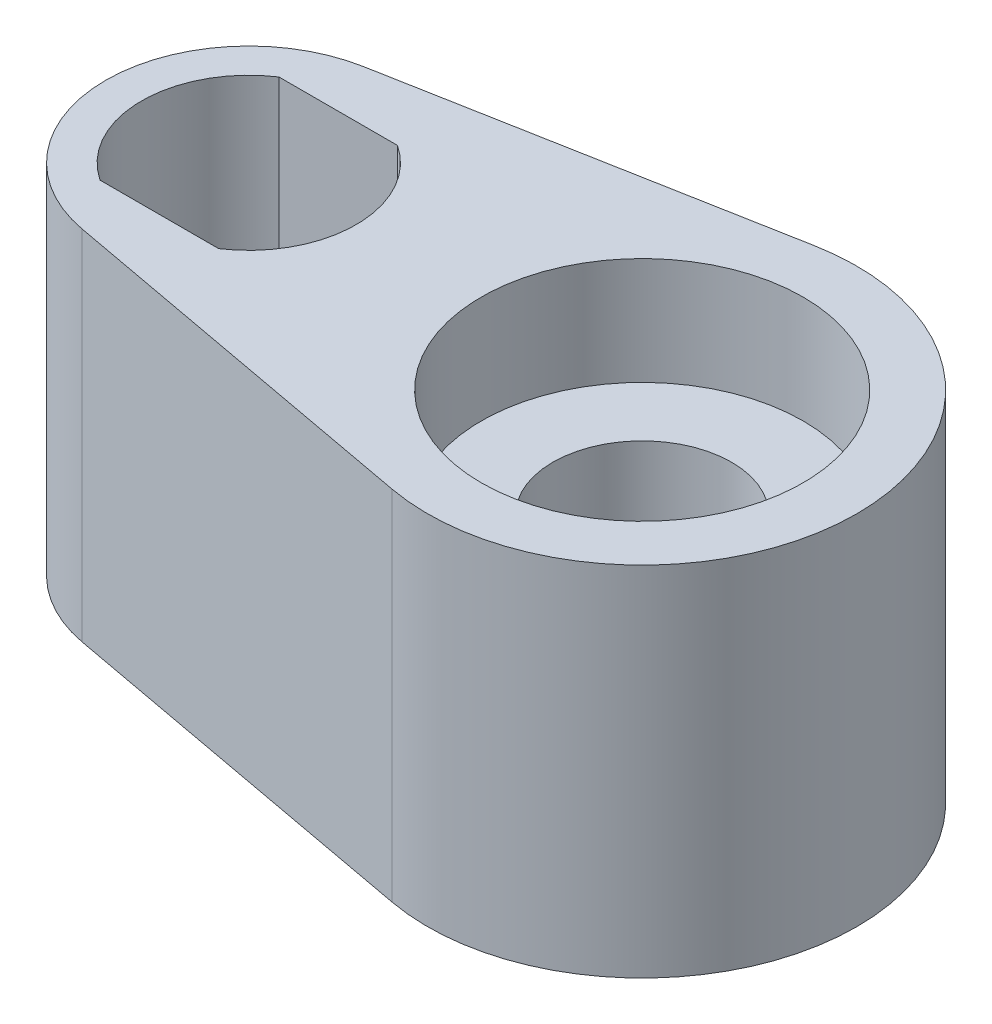
ISO-10303-21;
HEADER;
FILE_DESCRIPTION(('STEP AP214'),'2;1');
FILE_NAME('part.step','',(''),(''),'','','');
FILE_SCHEMA(('AUTOMOTIVE_DESIGN { 1 0 10303 214 1 1 1 1 }'));
ENDSEC;
DATA;
#1=APPLICATION_CONTEXT('core data for automotive mechanical design processes');
#2=APPLICATION_PROTOCOL_DEFINITION('international standard','automotive_design',2000,#1);
#3=PRODUCT_CONTEXT('',#1,'mechanical');
#4=PRODUCT('Part','Part','',(#3));
#5=PRODUCT_RELATED_PRODUCT_CATEGORY('part','',(#4));
#6=PRODUCT_DEFINITION_FORMATION('','',#4);
#7=PRODUCT_DEFINITION_CONTEXT('part definition',#1,'design');
#8=PRODUCT_DEFINITION('design','',#6,#7);
#9=PRODUCT_DEFINITION_SHAPE('','',#8);
#10=(LENGTH_UNIT() NAMED_UNIT(*) SI_UNIT(.MILLI.,.METRE.));
#11=(NAMED_UNIT(*) PLANE_ANGLE_UNIT() SI_UNIT($,.RADIAN.));
#12=(NAMED_UNIT(*) SI_UNIT($,.STERADIAN.) SOLID_ANGLE_UNIT());
#13=UNCERTAINTY_MEASURE_WITH_UNIT(LENGTH_MEASURE(1.E-05),#10,'distance_accuracy_value','');
#14=(GEOMETRIC_REPRESENTATION_CONTEXT(3) GLOBAL_UNCERTAINTY_ASSIGNED_CONTEXT((#13)) GLOBAL_UNIT_ASSIGNED_CONTEXT((#10,
#11,#12)) REPRESENTATION_CONTEXT('',''));
#15=CARTESIAN_POINT('',(0.,0.,0.));
#16=DIRECTION('',(0.,0.,1.));
#17=DIRECTION('',(1.,0.,0.));
#18=AXIS2_PLACEMENT_3D('',#15,#16,#17);
#19=CARTESIAN_POINT('',(11.,37.9069194034805,0.));
#20=DIRECTION('',(0.,-1.,0.));
#21=DIRECTION('',(0.,0.,-1.));
#22=AXIS2_PLACEMENT_3D('',#19,#20,#21);
#23=CYLINDRICAL_SURFACE('',#22,2.5);
#24=CARTESIAN_POINT('',(11.,6.5,0.));
#25=DIRECTION('',(0.,-1.,0.));
#26=DIRECTION('',(0.,0.,-1.));
#27=AXIS2_PLACEMENT_3D('',#24,#25,#26);
#28=CIRCLE('',#27,2.5);
#29=CARTESIAN_POINT('',(11.,6.5,-2.5));
#30=VERTEX_POINT('',#29);
#31=EDGE_CURVE('E120',#30,#30,#28,.T.);
#32=ORIENTED_EDGE('',*,*,#31,.T.);
#33=EDGE_LOOP('',(#32));
#34=FACE_BOUND('',#33,.T.);
#35=CARTESIAN_POINT('',(11.,13.5,0.));
#36=DIRECTION('',(0.,1.,0.));
#37=DIRECTION('',(0.,0.,1.));
#38=AXIS2_PLACEMENT_3D('',#35,#36,#37);
#39=CIRCLE('',#38,2.5);
#40=CARTESIAN_POINT('',(11.,13.5,2.5));
#41=VERTEX_POINT('',#40);
#42=EDGE_CURVE('E149',#41,#41,#39,.F.);
#43=ORIENTED_EDGE('',*,*,#42,.F.);
#44=EDGE_LOOP('',(#43));
#45=FACE_BOUND('',#44,.T.);
#46=ADVANCED_FACE('F35',(#34,#45),#23,.F.);
#47=CARTESIAN_POINT('',(0.,6.5,0.));
#48=DIRECTION('',(0.,-1.,0.));
#49=DIRECTION('',(0.,0.,-1.));
#50=AXIS2_PLACEMENT_3D('',#47,#48,#49);
#51=CYLINDRICAL_SURFACE('',#50,1.1);
#52=CARTESIAN_POINT('',(0.,6.5,0.));
#53=DIRECTION('',(0.,1.,0.));
#54=DIRECTION('',(0.,0.,1.));
#55=AXIS2_PLACEMENT_3D('',#52,#53,#54);
#56=CIRCLE('',#55,1.1);
#57=CARTESIAN_POINT('',(0.,6.5,-1.1));
#58=VERTEX_POINT('',#57);
#59=EDGE_CURVE('E39',#58,#58,#56,.T.);
#60=CARTESIAN_POINT('',(0.,7.5,0.));
#61=DIRECTION('',(0.,1.,0.));
#62=DIRECTION('',(0.,0.,1.));
#63=AXIS2_PLACEMENT_3D('',#60,#61,#62);
#64=CIRCLE('',#63,1.1);
#65=CARTESIAN_POINT('',(0.,7.5,-1.1));
#66=VERTEX_POINT('',#65);
#67=EDGE_CURVE('E44',#66,#66,#64,.T.);
#68=CARTESIAN_POINT('',(0.,6.5,-1.1));
#69=CARTESIAN_POINT('',(0.,6.51041666666667,-1.1));
#70=CARTESIAN_POINT('',(0.,6.52083333333333,-1.1));
#71=CARTESIAN_POINT('',(0.,6.54166666666667,-1.1));
#72=CARTESIAN_POINT('',(0.,6.55208333333333,-1.1));
#73=CARTESIAN_POINT('',(0.,6.57291666666667,-1.1));
#74=CARTESIAN_POINT('',(0.,6.58333333333333,-1.1));
#75=CARTESIAN_POINT('',(0.,6.60416666666667,-1.1));
#76=CARTESIAN_POINT('',(0.,6.61458333333333,-1.1));
#77=CARTESIAN_POINT('',(0.,6.63541666666667,-1.1));
#78=CARTESIAN_POINT('',(0.,6.64583333333333,-1.1));
#79=CARTESIAN_POINT('',(0.,6.66666666666667,-1.1));
#80=CARTESIAN_POINT('',(0.,6.67708333333333,-1.1));
#81=CARTESIAN_POINT('',(0.,6.69791666666667,-1.1));
#82=CARTESIAN_POINT('',(0.,6.70833333333333,-1.1));
#83=CARTESIAN_POINT('',(0.,6.72916666666667,-1.1));
#84=CARTESIAN_POINT('',(0.,6.73958333333333,-1.1));
#85=CARTESIAN_POINT('',(0.,6.76041666666667,-1.1));
#86=CARTESIAN_POINT('',(0.,6.77083333333333,-1.1));
#87=CARTESIAN_POINT('',(0.,6.79166666666667,-1.1));
#88=CARTESIAN_POINT('',(0.,6.80208333333333,-1.1));
#89=CARTESIAN_POINT('',(0.,6.82291666666667,-1.1));
#90=CARTESIAN_POINT('',(0.,6.83333333333333,-1.1));
#91=CARTESIAN_POINT('',(0.,6.85416666666667,-1.1));
#92=CARTESIAN_POINT('',(0.,6.86458333333333,-1.1));
#93=CARTESIAN_POINT('',(0.,6.88541666666667,-1.1));
#94=CARTESIAN_POINT('',(0.,6.89583333333333,-1.1));
#95=CARTESIAN_POINT('',(0.,6.91666666666667,-1.1));
#96=CARTESIAN_POINT('',(0.,6.92708333333333,-1.1));
#97=CARTESIAN_POINT('',(0.,6.94791666666667,-1.1));
#98=CARTESIAN_POINT('',(0.,6.95833333333333,-1.1));
#99=CARTESIAN_POINT('',(0.,6.97916666666667,-1.1));
#100=CARTESIAN_POINT('',(0.,6.98958333333333,-1.1));
#101=CARTESIAN_POINT('',(0.,7.01041666666667,-1.1));
#102=CARTESIAN_POINT('',(0.,7.02083333333333,-1.1));
#103=CARTESIAN_POINT('',(0.,7.04166666666667,-1.1));
#104=CARTESIAN_POINT('',(0.,7.05208333333333,-1.1));
#105=CARTESIAN_POINT('',(0.,7.07291666666667,-1.1));
#106=CARTESIAN_POINT('',(0.,7.08333333333333,-1.1));
#107=CARTESIAN_POINT('',(0.,7.10416666666667,-1.1));
#108=CARTESIAN_POINT('',(0.,7.11458333333333,-1.1));
#109=CARTESIAN_POINT('',(0.,7.13541666666667,-1.1));
#110=CARTESIAN_POINT('',(0.,7.14583333333333,-1.1));
#111=CARTESIAN_POINT('',(0.,7.16666666666667,-1.1));
#112=CARTESIAN_POINT('',(0.,7.17708333333333,-1.1));
#113=CARTESIAN_POINT('',(0.,7.19791666666667,-1.1));
#114=CARTESIAN_POINT('',(0.,7.20833333333333,-1.1));
#115=CARTESIAN_POINT('',(0.,7.22916666666667,-1.1));
#116=CARTESIAN_POINT('',(0.,7.23958333333333,-1.1));
#117=CARTESIAN_POINT('',(0.,7.26041666666667,-1.1));
#118=CARTESIAN_POINT('',(0.,7.27083333333333,-1.1));
#119=CARTESIAN_POINT('',(0.,7.29166666666667,-1.1));
#120=CARTESIAN_POINT('',(0.,7.30208333333333,-1.1));
#121=CARTESIAN_POINT('',(0.,7.32291666666667,-1.1));
#122=CARTESIAN_POINT('',(0.,7.33333333333333,-1.1));
#123=CARTESIAN_POINT('',(0.,7.35416666666667,-1.1));
#124=CARTESIAN_POINT('',(0.,7.36458333333333,-1.1));
#125=CARTESIAN_POINT('',(0.,7.38541666666667,-1.1));
#126=CARTESIAN_POINT('',(0.,7.39583333333333,-1.1));
#127=CARTESIAN_POINT('',(0.,7.41666666666667,-1.1));
#128=CARTESIAN_POINT('',(0.,7.42708333333333,-1.1));
#129=CARTESIAN_POINT('',(0.,7.44791666666667,-1.1));
#130=CARTESIAN_POINT('',(0.,7.45833333333333,-1.1));
#131=CARTESIAN_POINT('',(0.,7.47916666666667,-1.1));
#132=CARTESIAN_POINT('',(0.,7.48958333333333,-1.1));
#133=CARTESIAN_POINT('',(0.,7.5,-1.1));
#134=B_SPLINE_CURVE_WITH_KNOTS('',3,(#68,#69,#70,#71,#72,#73,#74,#75,#76,#77,#78,#79,#80,#81,
#82,#83,#84,#85,#86,#87,#88,#89,#90,#91,#92,#93,#94,#95,#96,#97,#98,#99,#100,#101,#102,#103,
#104,#105,#106,#107,#108,#109,#110,#111,#112,#113,#114,#115,#116,#117,#118,#119,#120,#121,#122,
#123,#124,#125,#126,#127,#128,#129,#130,#131,#132,#133),.UNSPECIFIED.,.F.,.F.,(4,2,2,2,2,2,2,2,
2,2,2,2,2,2,2,2,2,2,2,2,2,2,2,2,2,2,2,2,2,2,2,2,4),(0.,0.03125,0.0625000000000001,
0.0937500000000001,0.125,0.15625,0.1875,0.21875,0.25,0.28125,0.3125,0.34375,0.375,0.40625,
0.4375,0.46875,0.5,0.53125,0.5625,0.593750000000001,0.625000000000001,0.656250000000001,
0.687500000000001,0.718750000000001,0.750000000000001,0.781250000000001,0.812500000000001,
0.843750000000001,0.875000000000001,0.906250000000001,0.9375,0.96875,1.),.UNSPECIFIED.);
#135=EDGE_CURVE('BSEAM37',#58,#66,#134,.T.);
#136=ORIENTED_EDGE('',*,*,#59,.F.);
#137=ORIENTED_EDGE('',*,*,#67,.T.);
#138=ORIENTED_EDGE('',*,*,#135,.T.);
#139=ORIENTED_EDGE('',*,*,#135,.F.);
#140=EDGE_LOOP('',(#136,#138,#137,#139));
#141=FACE_BOUND('',#140,.T.);
#142=ADVANCED_FACE('F37',(#141),#51,.F.);
#143=CARTESIAN_POINT('',(0.,7.5,0.));
#144=DIRECTION('',(0.,1.,0.));
#145=DIRECTION('',(0.,0.,1.));
#146=AXIS2_PLACEMENT_3D('',#143,#144,#145);
#147=PLANE('',#146);
#148=CARTESIAN_POINT('',(0.,7.5,0.));
#149=DIRECTION('',(0.,1.,0.));
#150=DIRECTION('',(0.,0.,1.));
#151=AXIS2_PLACEMENT_3D('',#148,#149,#150);
#152=CIRCLE('',#151,3.);
#153=CARTESIAN_POINT('',(-1.6583123951777,7.5,-2.5));
#154=VERTEX_POINT('',#153);
#155=CARTESIAN_POINT('',(-1.6583123951777,7.5,2.5));
#156=VERTEX_POINT('',#155);
#157=EDGE_CURVE('E110',#154,#156,#152,.T.);
#158=ORIENTED_EDGE('',*,*,#157,.T.);
#159=DIRECTION('',(1.,0.,0.));
#160=VECTOR('',#159,1.);
#161=CARTESIAN_POINT('',(0.,7.5,2.5));
#162=LINE('',#161,#160);
#163=CARTESIAN_POINT('',(1.6583123951777,7.5,2.5));
#164=VERTEX_POINT('',#163);
#165=EDGE_CURVE('E138',#156,#164,#162,.T.);
#166=ORIENTED_EDGE('',*,*,#165,.T.);
#167=CARTESIAN_POINT('',(0.,7.5,0.));
#168=DIRECTION('',(0.,1.,0.));
#169=DIRECTION('',(0.,0.,1.));
#170=AXIS2_PLACEMENT_3D('',#167,#168,#169);
#171=CIRCLE('',#170,3.);
#172=CARTESIAN_POINT('',(1.6583123951777,7.5,-2.5));
#173=VERTEX_POINT('',#172);
#174=EDGE_CURVE('E136',#164,#173,#171,.T.);
#175=ORIENTED_EDGE('',*,*,#174,.T.);
#176=DIRECTION('',(1.,0.,0.));
#177=VECTOR('',#176,1.);
#178=CARTESIAN_POINT('',(0.,7.5,-2.5));
#179=LINE('',#178,#177);
#180=EDGE_CURVE('E60',#154,#173,#179,.T.);
#181=ORIENTED_EDGE('',*,*,#180,.F.);
#182=EDGE_LOOP('',(#158,#166,#175,#181));
#183=FACE_BOUND('',#182,.T.);
#184=ORIENTED_EDGE('',*,*,#67,.F.);
#185=EDGE_LOOP('',(#184));
#186=FACE_BOUND('',#185,.T.);
#187=ADVANCED_FACE('F213',(#183,#186),#147,.T.);
#188=CARTESIAN_POINT('',(0.,6.5,0.));
#189=DIRECTION('',(0.,1.,0.));
#190=DIRECTION('',(0.,0.,1.));
#191=AXIS2_PLACEMENT_3D('',#188,#189,#190);
#192=PLANE('',#191);
#193=CARTESIAN_POINT('',(0.,6.5,0.));
#194=DIRECTION('',(0.,1.,0.));
#195=DIRECTION('',(0.,0.,1.));
#196=AXIS2_PLACEMENT_3D('',#193,#194,#195);
#197=CIRCLE('',#196,4.);
#198=CARTESIAN_POINT('',(-0.727272727272729,6.5,-3.93332866414253));
#199=VERTEX_POINT('',#198);
#200=CARTESIAN_POINT('',(-0.727272727272729,6.5,3.93332866414253));
#201=VERTEX_POINT('',#200);
#202=EDGE_CURVE('E11',#199,#201,#197,.T.);
#203=ORIENTED_EDGE('',*,*,#202,.F.);
#204=DIRECTION('',(0.983332166035634,0.,-0.181818181818182));
#205=VECTOR('',#204,1.);
#206=CARTESIAN_POINT('',(-0.727272727272728,6.5,-3.93332866414253));
#207=LINE('',#206,#205);
#208=CARTESIAN_POINT('',(9.90909090909091,6.5,-5.8999929962138));
#209=VERTEX_POINT('',#208);
#210=EDGE_CURVE('E111',#199,#209,#207,.T.);
#211=ORIENTED_EDGE('',*,*,#210,.T.);
#212=CARTESIAN_POINT('',(11.,6.5,0.));
#213=DIRECTION('',(0.,-1.,0.));
#214=DIRECTION('',(0.,0.,-1.));
#215=AXIS2_PLACEMENT_3D('',#212,#213,#214);
#216=CIRCLE('',#215,6.);
#217=CARTESIAN_POINT('',(9.9090909090909,6.5,5.8999929962138));
#218=VERTEX_POINT('',#217);
#219=EDGE_CURVE('E166',#209,#218,#216,.T.);
#220=ORIENTED_EDGE('',*,*,#219,.T.);
#221=DIRECTION('',(0.983332166035634,0.,0.181818181818182));
#222=VECTOR('',#221,1.);
#223=CARTESIAN_POINT('',(-0.727272727272728,6.5,3.93332866414253));
#224=LINE('',#223,#222);
#225=EDGE_CURVE('E119',#201,#218,#224,.T.);
#226=ORIENTED_EDGE('',*,*,#225,.F.);
#227=EDGE_LOOP('',(#203,#211,#220,#226));
#228=FACE_BOUND('',#227,.T.);
#229=ORIENTED_EDGE('',*,*,#31,.F.);
#230=EDGE_LOOP('',(#229));
#231=FACE_BOUND('',#230,.T.);
#232=ORIENTED_EDGE('',*,*,#59,.T.);
#233=EDGE_LOOP('',(#232));
#234=FACE_BOUND('',#233,.T.);
#235=ADVANCED_FACE('F282',(#228,#231,#234),#192,.F.);
#236=CARTESIAN_POINT('',(0.,7.5,0.));
#237=DIRECTION('',(0.,-1.,0.));
#238=DIRECTION('',(0.,0.,-1.));
#239=AXIS2_PLACEMENT_3D('',#236,#237,#238);
#240=CYLINDRICAL_SURFACE('',#239,4.);
#241=CARTESIAN_POINT('',(0.,16.5,0.));
#242=DIRECTION('',(0.,1.,0.));
#243=DIRECTION('',(0.,0.,1.));
#244=AXIS2_PLACEMENT_3D('',#241,#242,#243);
#245=CIRCLE('',#244,4.);
#246=CARTESIAN_POINT('',(-0.727272727272728,16.5,-3.93332866414253));
#247=VERTEX_POINT('',#246);
#248=CARTESIAN_POINT('',(-0.727272727272729,16.5,3.93332866414253));
#249=VERTEX_POINT('',#248);
#250=EDGE_CURVE('E117',#247,#249,#245,.T.);
#251=ORIENTED_EDGE('',*,*,#250,.F.);
#252=DIRECTION('',(0.,-1.,0.));
#253=VECTOR('',#252,1.);
#254=CARTESIAN_POINT('',(-0.727272727272729,37.9069194034805,-3.93332866414253));
#255=LINE('',#254,#253);
#256=EDGE_CURVE('E172',#247,#199,#255,.T.);
#257=ORIENTED_EDGE('',*,*,#256,.T.);
#258=ORIENTED_EDGE('',*,*,#202,.T.);
#259=DIRECTION('',(0.,-1.,0.));
#260=VECTOR('',#259,1.);
#261=CARTESIAN_POINT('',(-0.727272727272729,37.9069194034805,3.93332866414253));
#262=LINE('',#261,#260);
#263=EDGE_CURVE('E106',#249,#201,#262,.T.);
#264=ORIENTED_EDGE('',*,*,#263,.F.);
#265=EDGE_LOOP('',(#251,#257,#258,#264));
#266=FACE_BOUND('',#265,.T.);
#267=ADVANCED_FACE('F115',(#266),#240,.T.);
#268=CARTESIAN_POINT('',(0.,16.5,0.));
#269=DIRECTION('',(0.,-1.,0.));
#270=DIRECTION('',(0.,0.,-1.));
#271=AXIS2_PLACEMENT_3D('',#268,#269,#270);
#272=CYLINDRICAL_SURFACE('',#271,3.);
#273=ORIENTED_EDGE('',*,*,#157,.F.);
#274=DIRECTION('',(0.,-1.,0.));
#275=VECTOR('',#274,1.);
#276=CARTESIAN_POINT('',(-1.6583123951777,16.5,-2.5));
#277=LINE('',#276,#275);
#278=CARTESIAN_POINT('',(-1.6583123951777,16.5,-2.5));
#279=VERTEX_POINT('',#278);
#280=EDGE_CURVE('E146',#279,#154,#277,.T.);
#281=ORIENTED_EDGE('',*,*,#280,.F.);
#282=CARTESIAN_POINT('',(0.,16.5,0.));
#283=DIRECTION('',(0.,1.,0.));
#284=DIRECTION('',(0.,0.,1.));
#285=AXIS2_PLACEMENT_3D('',#282,#283,#284);
#286=CIRCLE('',#285,3.);
#287=CARTESIAN_POINT('',(-1.6583123951777,16.5,2.5));
#288=VERTEX_POINT('',#287);
#289=EDGE_CURVE('E139',#279,#288,#286,.T.);
#290=ORIENTED_EDGE('',*,*,#289,.T.);
#291=DIRECTION('',(0.,-1.,0.));
#292=VECTOR('',#291,1.);
#293=CARTESIAN_POINT('',(-1.6583123951777,16.5,2.5));
#294=LINE('',#293,#292);
#295=EDGE_CURVE('E123',#288,#156,#294,.T.);
#296=ORIENTED_EDGE('',*,*,#295,.T.);
#297=EDGE_LOOP('',(#273,#281,#290,#296));
#298=FACE_BOUND('',#297,.T.);
#299=ADVANCED_FACE('F196',(#298),#272,.F.);
#300=CARTESIAN_POINT('',(0.,16.5,-2.5));
#301=DIRECTION('',(0.,0.,-1.));
#302=DIRECTION('',(-1.,0.,0.));
#303=AXIS2_PLACEMENT_3D('',#300,#301,#302);
#304=PLANE('',#303);
#305=ORIENTED_EDGE('',*,*,#180,.T.);
#306=DIRECTION('',(0.,-1.,0.));
#307=VECTOR('',#306,1.);
#308=CARTESIAN_POINT('',(1.6583123951777,16.5,-2.5));
#309=LINE('',#308,#307);
#310=CARTESIAN_POINT('',(1.6583123951777,16.5,-2.5));
#311=VERTEX_POINT('',#310);
#312=EDGE_CURVE('E143',#311,#173,#309,.T.);
#313=ORIENTED_EDGE('',*,*,#312,.F.);
#314=DIRECTION('',(1.,0.,0.));
#315=VECTOR('',#314,1.);
#316=CARTESIAN_POINT('',(0.,16.5,-2.5));
#317=LINE('',#316,#315);
#318=EDGE_CURVE('E180',#279,#311,#317,.T.);
#319=ORIENTED_EDGE('',*,*,#318,.F.);
#320=ORIENTED_EDGE('',*,*,#280,.T.);
#321=EDGE_LOOP('',(#305,#313,#319,#320));
#322=FACE_BOUND('',#321,.T.);
#323=ADVANCED_FACE('F198',(#322),#304,.F.);
#324=CARTESIAN_POINT('',(0.,16.5,0.));
#325=DIRECTION('',(0.,-1.,0.));
#326=DIRECTION('',(0.,0.,-1.));
#327=AXIS2_PLACEMENT_3D('',#324,#325,#326);
#328=CYLINDRICAL_SURFACE('',#327,3.);
#329=ORIENTED_EDGE('',*,*,#174,.F.);
#330=DIRECTION('',(0.,-1.,0.));
#331=VECTOR('',#330,1.);
#332=CARTESIAN_POINT('',(1.6583123951777,16.5,2.5));
#333=LINE('',#332,#331);
#334=CARTESIAN_POINT('',(1.6583123951777,16.5,2.5));
#335=VERTEX_POINT('',#334);
#336=EDGE_CURVE('E127',#335,#164,#333,.T.);
#337=ORIENTED_EDGE('',*,*,#336,.F.);
#338=CARTESIAN_POINT('',(0.,16.5,0.));
#339=DIRECTION('',(0.,1.,0.));
#340=DIRECTION('',(0.,0.,1.));
#341=AXIS2_PLACEMENT_3D('',#338,#339,#340);
#342=CIRCLE('',#341,3.);
#343=EDGE_CURVE('E130',#335,#311,#342,.T.);
#344=ORIENTED_EDGE('',*,*,#343,.T.);
#345=ORIENTED_EDGE('',*,*,#312,.T.);
#346=EDGE_LOOP('',(#329,#337,#344,#345));
#347=FACE_BOUND('',#346,.T.);
#348=ADVANCED_FACE('F185',(#347),#328,.F.);
#349=CARTESIAN_POINT('',(0.,16.5,2.5));
#350=DIRECTION('',(0.,0.,-1.));
#351=DIRECTION('',(-1.,0.,0.));
#352=AXIS2_PLACEMENT_3D('',#349,#350,#351);
#353=PLANE('',#352);
#354=ORIENTED_EDGE('',*,*,#165,.F.);
#355=ORIENTED_EDGE('',*,*,#295,.F.);
#356=DIRECTION('',(1.,0.,0.));
#357=VECTOR('',#356,1.);
#358=CARTESIAN_POINT('',(0.,16.5,2.5));
#359=LINE('',#358,#357);
#360=EDGE_CURVE('E124',#288,#335,#359,.T.);
#361=ORIENTED_EDGE('',*,*,#360,.T.);
#362=ORIENTED_EDGE('',*,*,#336,.T.);
#363=EDGE_LOOP('',(#354,#355,#361,#362));
#364=FACE_BOUND('',#363,.T.);
#365=ADVANCED_FACE('F193',(#364),#353,.T.);
#366=CARTESIAN_POINT('',(0.,16.5,0.));
#367=DIRECTION('',(0.,1.,0.));
#368=DIRECTION('',(0.,0.,1.));
#369=AXIS2_PLACEMENT_3D('',#366,#367,#368);
#370=PLANE('',#369);
#371=CARTESIAN_POINT('',(11.,16.5,0.));
#372=DIRECTION('',(0.,1.,0.));
#373=DIRECTION('',(0.,0.,1.));
#374=AXIS2_PLACEMENT_3D('',#371,#372,#373);
#375=CIRCLE('',#374,4.5);
#376=CARTESIAN_POINT('',(11.,16.5,4.5));
#377=VERTEX_POINT('',#376);
#378=EDGE_CURVE('E157',#377,#377,#375,.T.);
#379=ORIENTED_EDGE('',*,*,#378,.F.);
#380=EDGE_LOOP('',(#379));
#381=FACE_BOUND('',#380,.T.);
#382=ORIENTED_EDGE('',*,*,#289,.F.);
#383=ORIENTED_EDGE('',*,*,#318,.T.);
#384=ORIENTED_EDGE('',*,*,#343,.F.);
#385=ORIENTED_EDGE('',*,*,#360,.F.);
#386=EDGE_LOOP('',(#382,#383,#384,#385));
#387=FACE_BOUND('',#386,.T.);
#388=ORIENTED_EDGE('',*,*,#250,.T.);
#389=DIRECTION('',(0.983332166035633,0.,0.181818181818182));
#390=VECTOR('',#389,1.);
#391=CARTESIAN_POINT('',(-0.727272727272728,16.5,3.93332866414253));
#392=LINE('',#391,#390);
#393=CARTESIAN_POINT('',(9.9090909090909,16.5,5.8999929962138));
#394=VERTEX_POINT('',#393);
#395=EDGE_CURVE('E102',#249,#394,#392,.T.);
#396=ORIENTED_EDGE('',*,*,#395,.T.);
#397=CARTESIAN_POINT('',(11.,16.5,0.));
#398=DIRECTION('',(0.,1.,0.));
#399=DIRECTION('',(0.,0.,1.));
#400=AXIS2_PLACEMENT_3D('',#397,#398,#399);
#401=CIRCLE('',#400,6.);
#402=CARTESIAN_POINT('',(9.90909090909091,16.5,-5.8999929962138));
#403=VERTEX_POINT('',#402);
#404=EDGE_CURVE('E151',#403,#394,#401,.F.);
#405=ORIENTED_EDGE('',*,*,#404,.F.);
#406=DIRECTION('',(0.983332166035633,0.,-0.181818181818182));
#407=VECTOR('',#406,1.);
#408=CARTESIAN_POINT('',(-0.727272727272728,16.5,-3.93332866414253));
#409=LINE('',#408,#407);
#410=EDGE_CURVE('E52',#247,#403,#409,.T.);
#411=ORIENTED_EDGE('',*,*,#410,.F.);
#412=EDGE_LOOP('',(#388,#396,#405,#411));
#413=FACE_BOUND('',#412,.T.);
#414=ADVANCED_FACE('F122',(#381,#387,#413),#370,.T.);
#415=CARTESIAN_POINT('',(11.,37.9069194034805,0.));
#416=DIRECTION('',(0.,-1.,0.));
#417=DIRECTION('',(0.,0.,-1.));
#418=AXIS2_PLACEMENT_3D('',#415,#416,#417);
#419=CYLINDRICAL_SURFACE('',#418,6.);
#420=DIRECTION('',(0.,-1.,0.));
#421=VECTOR('',#420,1.);
#422=CARTESIAN_POINT('',(9.90909090909091,37.9069194034805,-5.8999929962138));
#423=LINE('',#422,#421);
#424=EDGE_CURVE('E173',#403,#209,#423,.T.);
#425=ORIENTED_EDGE('',*,*,#424,.F.);
#426=ORIENTED_EDGE('',*,*,#404,.T.);
#427=DIRECTION('',(0.,-1.,0.));
#428=VECTOR('',#427,1.);
#429=CARTESIAN_POINT('',(9.9090909090909,37.9069194034805,5.8999929962138));
#430=LINE('',#429,#428);
#431=EDGE_CURVE('E108',#394,#218,#430,.T.);
#432=ORIENTED_EDGE('',*,*,#431,.T.);
#433=ORIENTED_EDGE('',*,*,#219,.F.);
#434=EDGE_LOOP('',(#425,#426,#432,#433));
#435=FACE_BOUND('',#434,.T.);
#436=ADVANCED_FACE('F226',(#435),#419,.T.);
#437=CARTESIAN_POINT('',(-0.727272727272728,37.9069194034805,-3.93332866414253));
#438=DIRECTION('',(-0.181818181818182,0.,-0.983332166035633));
#439=DIRECTION('',(-0.983332166035633,0.,0.181818181818182));
#440=AXIS2_PLACEMENT_3D('',#437,#438,#439);
#441=PLANE('',#440);
#442=ORIENTED_EDGE('',*,*,#256,.F.);
#443=ORIENTED_EDGE('',*,*,#410,.T.);
#444=ORIENTED_EDGE('',*,*,#424,.T.);
#445=ORIENTED_EDGE('',*,*,#210,.F.);
#446=EDGE_LOOP('',(#442,#443,#444,#445));
#447=FACE_BOUND('',#446,.T.);
#448=ADVANCED_FACE('F223',(#447),#441,.T.);
#449=CARTESIAN_POINT('',(-0.727272727272728,37.9069194034805,3.93332866414253));
#450=DIRECTION('',(0.181818181818182,0.,-0.983332166035633));
#451=DIRECTION('',(-0.983332166035633,0.,-0.181818181818182));
#452=AXIS2_PLACEMENT_3D('',#449,#450,#451);
#453=PLANE('',#452);
#454=ORIENTED_EDGE('',*,*,#395,.F.);
#455=ORIENTED_EDGE('',*,*,#263,.T.);
#456=ORIENTED_EDGE('',*,*,#225,.T.);
#457=ORIENTED_EDGE('',*,*,#431,.F.);
#458=EDGE_LOOP('',(#454,#455,#456,#457));
#459=FACE_BOUND('',#458,.T.);
#460=ADVANCED_FACE('F104',(#459),#453,.F.);
#461=CARTESIAN_POINT('',(11.,13.5,0.));
#462=DIRECTION('',(0.,1.,0.));
#463=DIRECTION('',(0.,0.,1.));
#464=AXIS2_PLACEMENT_3D('',#461,#462,#463);
#465=PLANE('',#464);
#466=CARTESIAN_POINT('',(11.,13.5,0.));
#467=DIRECTION('',(0.,1.,0.));
#468=DIRECTION('',(0.,0.,1.));
#469=AXIS2_PLACEMENT_3D('',#466,#467,#468);
#470=CIRCLE('',#469,4.5);
#471=CARTESIAN_POINT('',(11.,13.5,4.5));
#472=VERTEX_POINT('',#471);
#473=EDGE_CURVE('E152',#472,#472,#470,.T.);
#474=ORIENTED_EDGE('',*,*,#473,.T.);
#475=EDGE_LOOP('',(#474));
#476=FACE_BOUND('',#475,.T.);
#477=ORIENTED_EDGE('',*,*,#42,.T.);
#478=EDGE_LOOP('',(#477));
#479=FACE_BOUND('',#478,.T.);
#480=ADVANCED_FACE('F222',(#476,#479),#465,.T.);
#481=CARTESIAN_POINT('',(11.,13.5,0.));
#482=DIRECTION('',(0.,1.,0.));
#483=DIRECTION('',(0.,0.,1.));
#484=AXIS2_PLACEMENT_3D('',#481,#482,#483);
#485=CYLINDRICAL_SURFACE('',#484,4.5);
#486=ORIENTED_EDGE('',*,*,#473,.F.);
#487=EDGE_LOOP('',(#486));
#488=FACE_BOUND('',#487,.T.);
#489=ORIENTED_EDGE('',*,*,#378,.T.);
#490=EDGE_LOOP('',(#489));
#491=FACE_BOUND('',#490,.T.);
#492=ADVANCED_FACE('F218',(#488,#491),#485,.F.);
#493=CLOSED_SHELL('',(#46,#142,#187,#235,#267,#299,#323,#348,#365,#414,#436,#448,#460,#480,#492));
#494=MANIFOLD_SOLID_BREP('B2',#493);
#495=ADVANCED_BREP_SHAPE_REPRESENTATION('',(#18,#494),#14);
#496=SHAPE_DEFINITION_REPRESENTATION(#9,#495);
ENDSEC;
END-ISO-10303-21;
